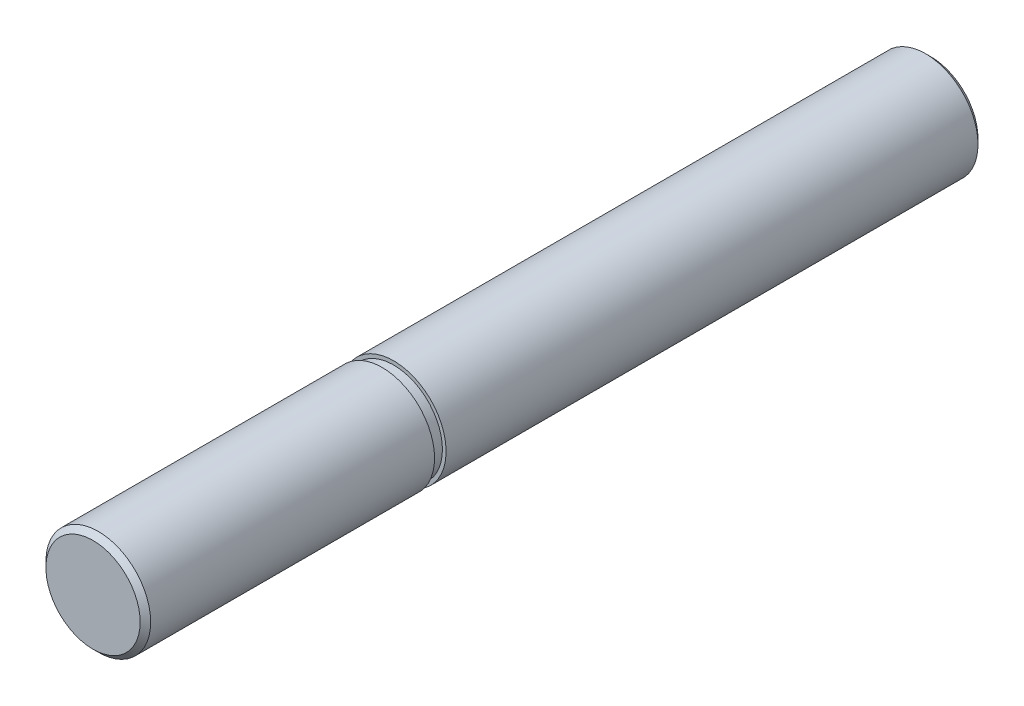
ISO-10303-21;
HEADER;
FILE_DESCRIPTION(('STEP AP214'),'2;1');
FILE_NAME('part.step','',(''),(''),'','','');
FILE_SCHEMA(('AUTOMOTIVE_DESIGN { 1 0 10303 214 1 1 1 1 }'));
ENDSEC;
DATA;
#1=APPLICATION_CONTEXT('core data for automotive mechanical design processes');
#2=APPLICATION_PROTOCOL_DEFINITION('international standard','automotive_design',2000,#1);
#3=PRODUCT_CONTEXT('',#1,'mechanical');
#4=PRODUCT('Part','Part','',(#3));
#5=PRODUCT_RELATED_PRODUCT_CATEGORY('part','',(#4));
#6=PRODUCT_DEFINITION_FORMATION('','',#4);
#7=PRODUCT_DEFINITION_CONTEXT('part definition',#1,'design');
#8=PRODUCT_DEFINITION('design','',#6,#7);
#9=PRODUCT_DEFINITION_SHAPE('','',#8);
#10=(LENGTH_UNIT() NAMED_UNIT(*) SI_UNIT(.MILLI.,.METRE.));
#11=(NAMED_UNIT(*) PLANE_ANGLE_UNIT() SI_UNIT($,.RADIAN.));
#12=(NAMED_UNIT(*) SI_UNIT($,.STERADIAN.) SOLID_ANGLE_UNIT());
#13=UNCERTAINTY_MEASURE_WITH_UNIT(LENGTH_MEASURE(1.E-05),#10,'distance_accuracy_value','');
#14=(GEOMETRIC_REPRESENTATION_CONTEXT(3) GLOBAL_UNCERTAINTY_ASSIGNED_CONTEXT((#13)) GLOBAL_UNIT_ASSIGNED_CONTEXT((#10,
#11,#12)) REPRESENTATION_CONTEXT('',''));
#15=CARTESIAN_POINT('',(0.,0.,0.));
#16=DIRECTION('',(0.,0.,1.));
#17=DIRECTION('',(1.,0.,0.));
#18=AXIS2_PLACEMENT_3D('',#15,#16,#17);
#19=CARTESIAN_POINT('',(0.,0.,80.));
#20=DIRECTION('',(0.,0.,-1.));
#21=DIRECTION('',(-1.,0.,0.));
#22=AXIS2_PLACEMENT_3D('',#19,#20,#21);
#23=CYLINDRICAL_SURFACE('',#22,5.);
#24=CARTESIAN_POINT('',(0.,0.,52.3899999169763));
#25=DIRECTION('',(0.,0.,1.));
#26=DIRECTION('',(1.,0.,0.));
#27=AXIS2_PLACEMENT_3D('',#24,#25,#26);
#28=CIRCLE('',#27,5.);
#29=CARTESIAN_POINT('',(5.,0.,52.3899999169763));
#30=VERTEX_POINT('',#29);
#31=EDGE_CURVE('E36',#30,#30,#28,.T.);
#32=ORIENTED_EDGE('',*,*,#31,.T.);
#33=EDGE_LOOP('',(#32));
#34=FACE_BOUND('',#33,.T.);
#35=CARTESIAN_POINT('',(0.,0.,79.5));
#36=DIRECTION('',(0.,0.,1.));
#37=DIRECTION('',(1.,0.,0.));
#38=AXIS2_PLACEMENT_3D('',#35,#36,#37);
#39=CIRCLE('',#38,5.);
#40=CARTESIAN_POINT('',(5.,0.,79.5));
#41=VERTEX_POINT('',#40);
#42=EDGE_CURVE('E54',#41,#41,#39,.F.);
#43=ORIENTED_EDGE('',*,*,#42,.T.);
#44=EDGE_LOOP('',(#43));
#45=FACE_BOUND('',#44,.T.);
#46=ADVANCED_FACE('F32',(#34,#45),#23,.T.);
#47=CARTESIAN_POINT('',(0.,0.,80.));
#48=DIRECTION('',(0.,0.,1.));
#49=DIRECTION('',(1.,0.,0.));
#50=AXIS2_PLACEMENT_3D('',#47,#48,#49);
#51=PLANE('',#50);
#52=CARTESIAN_POINT('',(0.,0.,80.));
#53=DIRECTION('',(0.,0.,1.));
#54=DIRECTION('',(1.,0.,0.));
#55=AXIS2_PLACEMENT_3D('',#52,#53,#54);
#56=CIRCLE('',#55,4.5);
#57=CARTESIAN_POINT('',(4.5,0.,80.));
#58=VERTEX_POINT('',#57);
#59=EDGE_CURVE('E10',#58,#58,#56,.T.);
#60=ORIENTED_EDGE('',*,*,#59,.T.);
#61=EDGE_LOOP('',(#60));
#62=FACE_BOUND('',#61,.T.);
#63=ADVANCED_FACE('F83',(#62),#51,.T.);
#64=CARTESIAN_POINT('',(0.,0.,80.));
#65=DIRECTION('',(0.,0.,-1.));
#66=DIRECTION('',(-1.,0.,0.));
#67=AXIS2_PLACEMENT_3D('',#64,#65,#66);
#68=CONICAL_SURFACE('',#67,4.5,0.785398163397445);
#69=ORIENTED_EDGE('',*,*,#42,.F.);
#70=EDGE_LOOP('',(#69));
#71=FACE_BOUND('',#70,.T.);
#72=ORIENTED_EDGE('',*,*,#59,.F.);
#73=EDGE_LOOP('',(#72));
#74=FACE_BOUND('',#73,.T.);
#75=ADVANCED_FACE('F34',(#71,#74),#68,.T.);
#76=CARTESIAN_POINT('',(4.65,0.,52.3899999169763));
#77=DIRECTION('',(0.,0.,1.));
#78=DIRECTION('',(1.,0.,0.));
#79=AXIS2_PLACEMENT_3D('',#76,#77,#78);
#80=PLANE('',#79);
#81=CARTESIAN_POINT('',(0.,0.,52.3899999169763));
#82=DIRECTION('',(0.,0.,1.));
#83=DIRECTION('',(1.,0.,0.));
#84=AXIS2_PLACEMENT_3D('',#81,#82,#83);
#85=CIRCLE('',#84,4.65);
#86=CARTESIAN_POINT('',(4.65,0.,52.3899999169763));
#87=VERTEX_POINT('',#86);
#88=EDGE_CURVE('E50',#87,#87,#85,.T.);
#89=ORIENTED_EDGE('',*,*,#88,.T.);
#90=EDGE_LOOP('',(#89));
#91=FACE_BOUND('',#90,.T.);
#92=ORIENTED_EDGE('',*,*,#31,.F.);
#93=EDGE_LOOP('',(#92));
#94=FACE_BOUND('',#93,.T.);
#95=ADVANCED_FACE('F95',(#91,#94),#80,.F.);
#96=CARTESIAN_POINT('',(4.65,0.,51.2899999169763));
#97=DIRECTION('',(0.,0.,-1.));
#98=DIRECTION('',(-1.,0.,0.));
#99=AXIS2_PLACEMENT_3D('',#96,#97,#98);
#100=PLANE('',#99);
#101=CARTESIAN_POINT('',(0.,0.,51.2899999169763));
#102=DIRECTION('',(0.,0.,1.));
#103=DIRECTION('',(1.,0.,0.));
#104=AXIS2_PLACEMENT_3D('',#101,#102,#103);
#105=CIRCLE('',#104,4.65);
#106=CARTESIAN_POINT('',(4.65,0.,51.2899999169763));
#107=VERTEX_POINT('',#106);
#108=EDGE_CURVE('E56',#107,#107,#105,.T.);
#109=ORIENTED_EDGE('',*,*,#108,.F.);
#110=EDGE_LOOP('',(#109));
#111=FACE_BOUND('',#110,.T.);
#112=CARTESIAN_POINT('',(0.,0.,51.2899999169763));
#113=DIRECTION('',(0.,0.,-1.));
#114=DIRECTION('',(-1.,0.,0.));
#115=AXIS2_PLACEMENT_3D('',#112,#113,#114);
#116=CIRCLE('',#115,5.);
#117=CARTESIAN_POINT('',(-5.,0.,51.2899999169763));
#118=VERTEX_POINT('',#117);
#119=EDGE_CURVE('E48',#118,#118,#116,.T.);
#120=ORIENTED_EDGE('',*,*,#119,.F.);
#121=EDGE_LOOP('',(#120));
#122=FACE_BOUND('',#121,.T.);
#123=ADVANCED_FACE('F93',(#111,#122),#100,.F.);
#124=CARTESIAN_POINT('',(0.,0.,79.5));
#125=DIRECTION('',(0.,0.,1.));
#126=DIRECTION('',(1.,0.,0.));
#127=AXIS2_PLACEMENT_3D('',#124,#125,#126);
#128=CYLINDRICAL_SURFACE('',#127,4.65);
#129=ORIENTED_EDGE('',*,*,#88,.F.);
#130=EDGE_LOOP('',(#129));
#131=FACE_BOUND('',#130,.T.);
#132=ORIENTED_EDGE('',*,*,#108,.T.);
#133=EDGE_LOOP('',(#132));
#134=FACE_BOUND('',#133,.T.);
#135=ADVANCED_FACE('F78',(#131,#134),#128,.T.);
#136=CARTESIAN_POINT('',(0.,0.,0.));
#137=DIRECTION('',(0.,0.,1.));
#138=DIRECTION('',(1.,0.,0.));
#139=AXIS2_PLACEMENT_3D('',#136,#137,#138);
#140=PLANE('',#139);
#141=CARTESIAN_POINT('',(0.,0.,0.));
#142=DIRECTION('',(0.,0.,1.));
#143=DIRECTION('',(1.,0.,0.));
#144=AXIS2_PLACEMENT_3D('',#141,#142,#143);
#145=CIRCLE('',#144,4.49999999999999);
#146=CARTESIAN_POINT('',(4.49999999999999,0.,0.));
#147=VERTEX_POINT('',#146);
#148=EDGE_CURVE('E40',#147,#147,#145,.F.);
#149=ORIENTED_EDGE('',*,*,#148,.T.);
#150=EDGE_LOOP('',(#149));
#151=FACE_BOUND('',#150,.T.);
#152=ADVANCED_FACE('F71',(#151),#140,.F.);
#153=CARTESIAN_POINT('',(0.,0.,0.500000000000014));
#154=DIRECTION('',(0.,0.,1.));
#155=DIRECTION('',(1.,0.,0.));
#156=AXIS2_PLACEMENT_3D('',#153,#154,#155);
#157=CONICAL_SURFACE('',#156,5.,0.785398163397445);
#158=ORIENTED_EDGE('',*,*,#148,.F.);
#159=EDGE_LOOP('',(#158));
#160=FACE_BOUND('',#159,.T.);
#161=CARTESIAN_POINT('',(0.,0.,0.500000000000014));
#162=DIRECTION('',(0.,0.,1.));
#163=DIRECTION('',(1.,0.,0.));
#164=AXIS2_PLACEMENT_3D('',#161,#162,#163);
#165=CIRCLE('',#164,5.);
#166=CARTESIAN_POINT('',(5.,0.,0.500000000000014));
#167=VERTEX_POINT('',#166);
#168=EDGE_CURVE('E45',#167,#167,#165,.T.);
#169=ORIENTED_EDGE('',*,*,#168,.F.);
#170=EDGE_LOOP('',(#169));
#171=FACE_BOUND('',#170,.T.);
#172=ADVANCED_FACE('F69',(#160,#171),#157,.T.);
#173=ORIENTED_EDGE('',*,*,#119,.T.);
#174=EDGE_LOOP('',(#173));
#175=FACE_BOUND('',#174,.T.);
#176=ORIENTED_EDGE('',*,*,#168,.T.);
#177=EDGE_LOOP('',(#176));
#178=FACE_BOUND('',#177,.T.);
#179=ADVANCED_FACE('F67',(#175,#178),#23,.T.);
#180=CLOSED_SHELL('',(#46,#63,#75,#95,#123,#135,#152,#172,#179));
#181=MANIFOLD_SOLID_BREP('B2',#180);
#182=ADVANCED_BREP_SHAPE_REPRESENTATION('',(#18,#181),#14);
#183=SHAPE_DEFINITION_REPRESENTATION(#9,#182);
ENDSEC;
END-ISO-10303-21;
